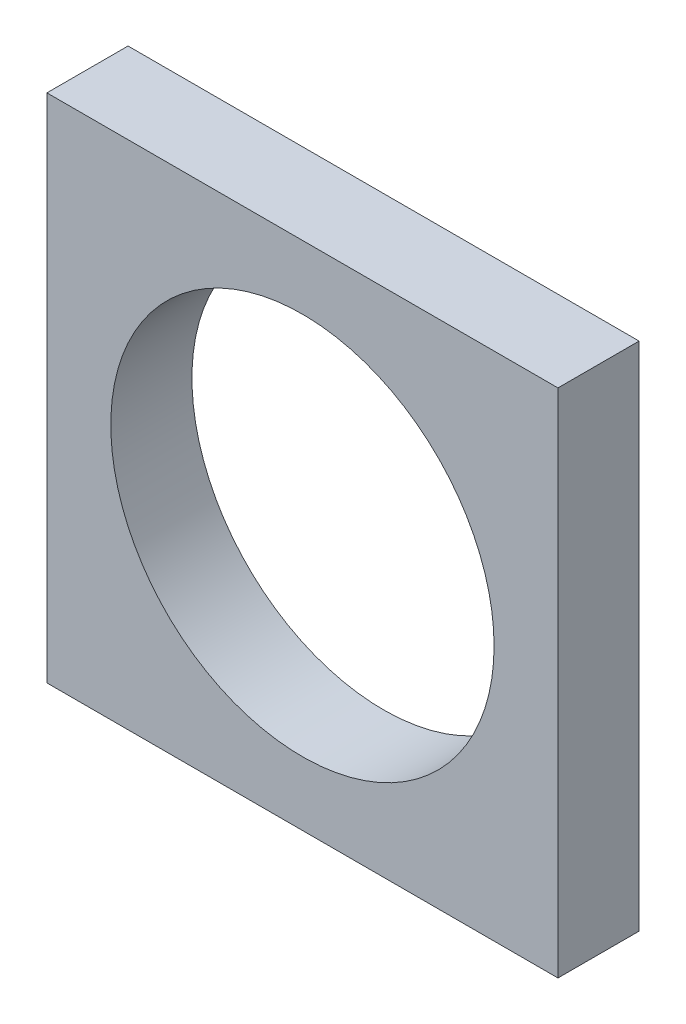
ISO-10303-21;
HEADER;
FILE_DESCRIPTION(('STEP AP214'),'2;1');
FILE_NAME('part.step','',(''),(''),'','','');
FILE_SCHEMA(('AUTOMOTIVE_DESIGN { 1 0 10303 214 1 1 1 1 }'));
ENDSEC;
DATA;
#1=APPLICATION_CONTEXT('core data for automotive mechanical design processes');
#2=APPLICATION_PROTOCOL_DEFINITION('international standard','automotive_design',2000,#1);
#3=PRODUCT_CONTEXT('',#1,'mechanical');
#4=PRODUCT('Part','Part','',(#3));
#5=PRODUCT_RELATED_PRODUCT_CATEGORY('part','',(#4));
#6=PRODUCT_DEFINITION_FORMATION('','',#4);
#7=PRODUCT_DEFINITION_CONTEXT('part definition',#1,'design');
#8=PRODUCT_DEFINITION('design','',#6,#7);
#9=PRODUCT_DEFINITION_SHAPE('','',#8);
#10=(LENGTH_UNIT() NAMED_UNIT(*) SI_UNIT(.MILLI.,.METRE.));
#11=(NAMED_UNIT(*) PLANE_ANGLE_UNIT() SI_UNIT($,.RADIAN.));
#12=(NAMED_UNIT(*) SI_UNIT($,.STERADIAN.) SOLID_ANGLE_UNIT());
#13=UNCERTAINTY_MEASURE_WITH_UNIT(LENGTH_MEASURE(1.E-05),#10,'distance_accuracy_value','');
#14=(GEOMETRIC_REPRESENTATION_CONTEXT(3) GLOBAL_UNCERTAINTY_ASSIGNED_CONTEXT((#13)) GLOBAL_UNIT_ASSIGNED_CONTEXT((#10,
#11,#12)) REPRESENTATION_CONTEXT('',''));
#15=CARTESIAN_POINT('',(0.,0.,0.));
#16=DIRECTION('',(0.,0.,1.));
#17=DIRECTION('',(1.,0.,0.));
#18=AXIS2_PLACEMENT_3D('',#15,#16,#17);
#19=CARTESIAN_POINT('',(0.,0.,3.175));
#20=DIRECTION('',(1.,0.,0.));
#21=DIRECTION('',(0.,0.,-1.));
#22=AXIS2_PLACEMENT_3D('',#19,#20,#21);
#23=PLANE('',#22);
#24=DIRECTION('',(0.,-1.,0.));
#25=VECTOR('',#24,1.);
#26=CARTESIAN_POINT('',(0.,0.,0.));
#27=LINE('',#26,#25);
#28=CARTESIAN_POINT('',(0.,20.,0.));
#29=VERTEX_POINT('',#28);
#30=CARTESIAN_POINT('',(0.,0.,0.));
#31=VERTEX_POINT('',#30);
#32=EDGE_CURVE('E95',#29,#31,#27,.T.);
#33=ORIENTED_EDGE('',*,*,#32,.T.);
#34=DIRECTION('',(0.,0.,-1.));
#35=VECTOR('',#34,1.);
#36=CARTESIAN_POINT('',(0.,0.,3.175));
#37=LINE('',#36,#35);
#38=CARTESIAN_POINT('',(0.,0.,3.175));
#39=VERTEX_POINT('',#38);
#40=EDGE_CURVE('E11',#39,#31,#37,.T.);
#41=ORIENTED_EDGE('',*,*,#40,.F.);
#42=DIRECTION('',(0.,-1.,0.));
#43=VECTOR('',#42,1.);
#44=CARTESIAN_POINT('',(0.,0.,3.175));
#45=LINE('',#44,#43);
#46=CARTESIAN_POINT('',(0.,20.,3.175));
#47=VERTEX_POINT('',#46);
#48=EDGE_CURVE('E83',#47,#39,#45,.T.);
#49=ORIENTED_EDGE('',*,*,#48,.F.);
#50=DIRECTION('',(0.,0.,-1.));
#51=VECTOR('',#50,1.);
#52=CARTESIAN_POINT('',(0.,20.,3.175));
#53=LINE('',#52,#51);
#54=EDGE_CURVE('E91',#47,#29,#53,.T.);
#55=ORIENTED_EDGE('',*,*,#54,.T.);
#56=EDGE_LOOP('',(#33,#41,#49,#55));
#57=FACE_BOUND('',#56,.T.);
#58=ADVANCED_FACE('F32',(#57),#23,.F.);
#59=CARTESIAN_POINT('',(0.,0.,3.175));
#60=DIRECTION('',(0.,1.,0.));
#61=DIRECTION('',(0.,0.,1.));
#62=AXIS2_PLACEMENT_3D('',#59,#60,#61);
#63=PLANE('',#62);
#64=DIRECTION('',(1.,0.,0.));
#65=VECTOR('',#64,1.);
#66=CARTESIAN_POINT('',(0.,0.,0.));
#67=LINE('',#66,#65);
#68=CARTESIAN_POINT('',(20.,0.,0.));
#69=VERTEX_POINT('',#68);
#70=EDGE_CURVE('E87',#31,#69,#67,.T.);
#71=ORIENTED_EDGE('',*,*,#70,.T.);
#72=DIRECTION('',(0.,0.,-1.));
#73=VECTOR('',#72,1.);
#74=CARTESIAN_POINT('',(20.,0.,3.175));
#75=LINE('',#74,#73);
#76=CARTESIAN_POINT('',(20.,0.,3.175));
#77=VERTEX_POINT('',#76);
#78=EDGE_CURVE('E40',#77,#69,#75,.T.);
#79=ORIENTED_EDGE('',*,*,#78,.F.);
#80=DIRECTION('',(1.,0.,0.));
#81=VECTOR('',#80,1.);
#82=CARTESIAN_POINT('',(0.,0.,3.175));
#83=LINE('',#82,#81);
#84=EDGE_CURVE('E78',#39,#77,#83,.T.);
#85=ORIENTED_EDGE('',*,*,#84,.F.);
#86=ORIENTED_EDGE('',*,*,#40,.T.);
#87=EDGE_LOOP('',(#71,#79,#85,#86));
#88=FACE_BOUND('',#87,.T.);
#89=ADVANCED_FACE('F86',(#88),#63,.F.);
#90=CARTESIAN_POINT('',(20.,0.,3.175));
#91=DIRECTION('',(-1.,0.,0.));
#92=DIRECTION('',(0.,0.,1.));
#93=AXIS2_PLACEMENT_3D('',#90,#91,#92);
#94=PLANE('',#93);
#95=DIRECTION('',(0.,1.,0.));
#96=VECTOR('',#95,1.);
#97=CARTESIAN_POINT('',(20.,0.,0.));
#98=LINE('',#97,#96);
#99=CARTESIAN_POINT('',(20.,20.,0.));
#100=VERTEX_POINT('',#99);
#101=EDGE_CURVE('E65',#69,#100,#98,.T.);
#102=ORIENTED_EDGE('',*,*,#101,.T.);
#103=DIRECTION('',(0.,0.,-1.));
#104=VECTOR('',#103,1.);
#105=CARTESIAN_POINT('',(20.,20.,3.175));
#106=LINE('',#105,#104);
#107=CARTESIAN_POINT('',(20.,20.,3.175));
#108=VERTEX_POINT('',#107);
#109=EDGE_CURVE('E88',#108,#100,#106,.T.);
#110=ORIENTED_EDGE('',*,*,#109,.F.);
#111=DIRECTION('',(0.,1.,0.));
#112=VECTOR('',#111,1.);
#113=CARTESIAN_POINT('',(20.,0.,3.175));
#114=LINE('',#113,#112);
#115=EDGE_CURVE('E81',#77,#108,#114,.T.);
#116=ORIENTED_EDGE('',*,*,#115,.F.);
#117=ORIENTED_EDGE('',*,*,#78,.T.);
#118=EDGE_LOOP('',(#102,#110,#116,#117));
#119=FACE_BOUND('',#118,.T.);
#120=ADVANCED_FACE('F89',(#119),#94,.F.);
#121=CARTESIAN_POINT('',(0.,20.,3.175));
#122=DIRECTION('',(0.,-1.,0.));
#123=DIRECTION('',(0.,0.,-1.));
#124=AXIS2_PLACEMENT_3D('',#121,#122,#123);
#125=PLANE('',#124);
#126=DIRECTION('',(-1.,0.,0.));
#127=VECTOR('',#126,1.);
#128=CARTESIAN_POINT('',(0.,20.,0.));
#129=LINE('',#128,#127);
#130=EDGE_CURVE('E71',#100,#29,#129,.T.);
#131=ORIENTED_EDGE('',*,*,#130,.T.);
#132=ORIENTED_EDGE('',*,*,#54,.F.);
#133=DIRECTION('',(-1.,0.,0.));
#134=VECTOR('',#133,1.);
#135=CARTESIAN_POINT('',(0.,20.,3.175));
#136=LINE('',#135,#134);
#137=EDGE_CURVE('E48',#108,#47,#136,.T.);
#138=ORIENTED_EDGE('',*,*,#137,.F.);
#139=ORIENTED_EDGE('',*,*,#109,.T.);
#140=EDGE_LOOP('',(#131,#132,#138,#139));
#141=FACE_BOUND('',#140,.T.);
#142=ADVANCED_FACE('F103',(#141),#125,.F.);
#143=CARTESIAN_POINT('',(0.,0.,3.175));
#144=DIRECTION('',(0.,0.,-1.));
#145=DIRECTION('',(-1.,0.,0.));
#146=AXIS2_PLACEMENT_3D('',#143,#144,#145);
#147=PLANE('',#146);
#148=CARTESIAN_POINT('',(10.,10.,3.175));
#149=DIRECTION('',(0.,0.,1.));
#150=DIRECTION('',(1.,0.,0.));
#151=AXIS2_PLACEMENT_3D('',#148,#149,#150);
#152=CIRCLE('',#151,7.5);
#153=CARTESIAN_POINT('',(17.5,10.,3.175));
#154=VERTEX_POINT('',#153);
#155=EDGE_CURVE('E109',#154,#154,#152,.T.);
#156=ORIENTED_EDGE('',*,*,#155,.F.);
#157=EDGE_LOOP('',(#156));
#158=FACE_BOUND('',#157,.T.);
#159=ORIENTED_EDGE('',*,*,#48,.T.);
#160=ORIENTED_EDGE('',*,*,#84,.T.);
#161=ORIENTED_EDGE('',*,*,#115,.T.);
#162=ORIENTED_EDGE('',*,*,#137,.T.);
#163=EDGE_LOOP('',(#159,#160,#161,#162));
#164=FACE_BOUND('',#163,.T.);
#165=ADVANCED_FACE('F79',(#158,#164),#147,.F.);
#166=CARTESIAN_POINT('',(0.,0.,0.));
#167=DIRECTION('',(0.,0.,-1.));
#168=DIRECTION('',(-1.,0.,0.));
#169=AXIS2_PLACEMENT_3D('',#166,#167,#168);
#170=PLANE('',#169);
#171=CARTESIAN_POINT('',(10.,10.,0.));
#172=DIRECTION('',(0.,0.,1.));
#173=DIRECTION('',(1.,0.,0.));
#174=AXIS2_PLACEMENT_3D('',#171,#172,#173);
#175=CIRCLE('',#174,7.5);
#176=CARTESIAN_POINT('',(17.5,10.,0.));
#177=VERTEX_POINT('',#176);
#178=EDGE_CURVE('E98',#177,#177,#175,.T.);
#179=ORIENTED_EDGE('',*,*,#178,.T.);
#180=EDGE_LOOP('',(#179));
#181=FACE_BOUND('',#180,.T.);
#182=ORIENTED_EDGE('',*,*,#32,.F.);
#183=ORIENTED_EDGE('',*,*,#130,.F.);
#184=ORIENTED_EDGE('',*,*,#101,.F.);
#185=ORIENTED_EDGE('',*,*,#70,.F.);
#186=EDGE_LOOP('',(#182,#183,#184,#185));
#187=FACE_BOUND('',#186,.T.);
#188=ADVANCED_FACE('F106',(#181,#187),#170,.T.);
#189=CARTESIAN_POINT('',(10.,10.,0.));
#190=DIRECTION('',(0.,0.,1.));
#191=DIRECTION('',(1.,0.,0.));
#192=AXIS2_PLACEMENT_3D('',#189,#190,#191);
#193=CYLINDRICAL_SURFACE('',#192,7.5);
#194=ORIENTED_EDGE('',*,*,#178,.F.);
#195=EDGE_LOOP('',(#194));
#196=FACE_BOUND('',#195,.T.);
#197=ORIENTED_EDGE('',*,*,#155,.T.);
#198=EDGE_LOOP('',(#197));
#199=FACE_BOUND('',#198,.T.);
#200=ADVANCED_FACE('F116',(#196,#199),#193,.F.);
#201=CLOSED_SHELL('',(#58,#89,#120,#142,#165,#188,#200));
#202=MANIFOLD_SOLID_BREP('B2',#201);
#203=ADVANCED_BREP_SHAPE_REPRESENTATION('',(#18,#202),#14);
#204=SHAPE_DEFINITION_REPRESENTATION(#9,#203);
ENDSEC;
END-ISO-10303-21;
